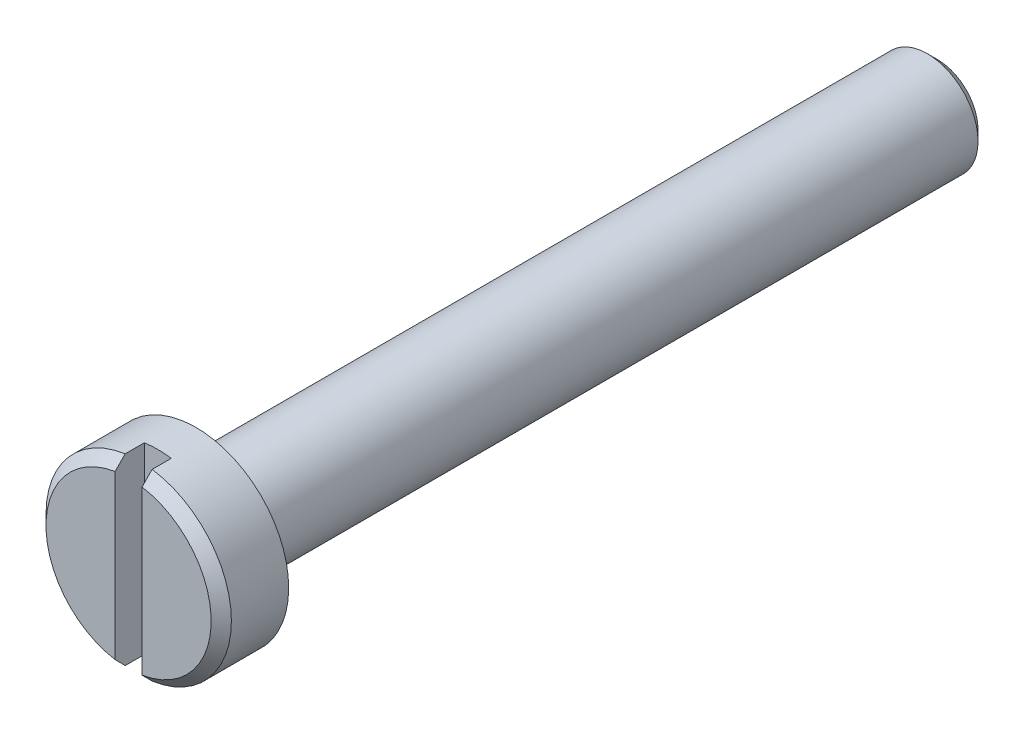
ISO-10303-21;
HEADER;
FILE_DESCRIPTION(('STEP AP214'),'2;1');
FILE_NAME('part.step','',(''),(''),'','','');
FILE_SCHEMA(('AUTOMOTIVE_DESIGN { 1 0 10303 214 1 1 1 1 }'));
ENDSEC;
DATA;
#1=APPLICATION_CONTEXT('core data for automotive mechanical design processes');
#2=APPLICATION_PROTOCOL_DEFINITION('international standard','automotive_design',2000,#1);
#3=PRODUCT_CONTEXT('',#1,'mechanical');
#4=PRODUCT('Part','Part','',(#3));
#5=PRODUCT_RELATED_PRODUCT_CATEGORY('part','',(#4));
#6=PRODUCT_DEFINITION_FORMATION('','',#4);
#7=PRODUCT_DEFINITION_CONTEXT('part definition',#1,'design');
#8=PRODUCT_DEFINITION('design','',#6,#7);
#9=PRODUCT_DEFINITION_SHAPE('','',#8);
#10=(LENGTH_UNIT() NAMED_UNIT(*) SI_UNIT(.MILLI.,.METRE.));
#11=(NAMED_UNIT(*) PLANE_ANGLE_UNIT() SI_UNIT($,.RADIAN.));
#12=(NAMED_UNIT(*) SI_UNIT($,.STERADIAN.) SOLID_ANGLE_UNIT());
#13=UNCERTAINTY_MEASURE_WITH_UNIT(LENGTH_MEASURE(1.E-05),#10,'distance_accuracy_value','');
#14=(GEOMETRIC_REPRESENTATION_CONTEXT(3) GLOBAL_UNCERTAINTY_ASSIGNED_CONTEXT((#13)) GLOBAL_UNIT_ASSIGNED_CONTEXT((#10,
#11,#12)) REPRESENTATION_CONTEXT('',''));
#15=CARTESIAN_POINT('',(0.,0.,0.));
#16=DIRECTION('',(0.,0.,1.));
#17=DIRECTION('',(1.,0.,0.));
#18=AXIS2_PLACEMENT_3D('',#15,#16,#17);
#19=CARTESIAN_POINT('',(0.,0.,2.));
#20=DIRECTION('',(0.,0.,1.));
#21=DIRECTION('',(1.,0.,0.));
#22=AXIS2_PLACEMENT_3D('',#19,#20,#21);
#23=PLANE('',#22);
#24=DIRECTION('',(0.,-1.,0.));
#25=VECTOR('',#24,1.);
#26=CARTESIAN_POINT('',(-0.4,0.,2.));
#27=LINE('',#26,#25);
#28=CARTESIAN_POINT('',(-0.4,2.41712639305437,2.));
#29=VERTEX_POINT('',#28);
#30=CARTESIAN_POINT('',(-0.4,-2.41712639305437,2.));
#31=VERTEX_POINT('',#30);
#32=EDGE_CURVE('E110',#29,#31,#27,.T.);
#33=ORIENTED_EDGE('',*,*,#32,.F.);
#34=CARTESIAN_POINT('',(0.,0.,2.));
#35=DIRECTION('',(0.,0.,1.));
#36=DIRECTION('',(1.,0.,0.));
#37=AXIS2_PLACEMENT_3D('',#34,#35,#36);
#38=CIRCLE('',#37,2.45);
#39=EDGE_CURVE('E134',#29,#31,#38,.T.);
#40=ORIENTED_EDGE('',*,*,#39,.T.);
#41=EDGE_LOOP('',(#33,#40));
#42=FACE_BOUND('',#41,.T.);
#43=ADVANCED_FACE('F35',(#42),#23,.T.);
#44=CARTESIAN_POINT('',(0.,0.,2.));
#45=DIRECTION('',(0.,0.,-1.));
#46=DIRECTION('',(-1.,0.,0.));
#47=AXIS2_PLACEMENT_3D('',#44,#45,#46);
#48=CONICAL_SURFACE('',#47,2.45,0.785398163397444);
#49=CARTESIAN_POINT('',(-0.4,6.04187900816895,-1.6051054449409));
#50=CARTESIAN_POINT('',(-0.4,5.83371761134151,-1.39740247856647));
#51=CARTESIAN_POINT('',(-0.4,5.62553628480855,-1.18971946726711));
#52=CARTESIAN_POINT('',(-0.4,5.20910350876451,-0.774415079748419));
#53=CARTESIAN_POINT('',(-0.4,5.00085205788207,-0.56679370490423));
#54=CARTESIAN_POINT('',(-0.4,4.58415907704698,-0.151544948861728));
#55=CARTESIAN_POINT('',(-0.4,4.37571750377377,0.0560823888685346));
#56=CARTESIAN_POINT('',(-0.4,3.95869973668701,0.471193398674151));
#57=CARTESIAN_POINT('',(-0.4,3.7501235456949,0.678677073582959));
#58=CARTESIAN_POINT('',(-0.4,3.33069138455204,1.0954587648502));
#59=CARTESIAN_POINT('',(-0.4,3.11983318358335,1.30475453627535));
#60=CARTESIAN_POINT('',(-0.4,2.69770631030097,1.72295751502337));
#61=CARTESIAN_POINT('',(-0.4,2.48643761424796,1.93186469841837));
#62=CARTESIAN_POINT('',(-0.4,2.16893930210294,2.2445586007645));
#63=CARTESIAN_POINT('',(-0.4,2.06302312692581,2.34866331265257));
#64=CARTESIAN_POINT('',(-0.4,1.85085482225619,2.55653499003892));
#65=CARTESIAN_POINT('',(-0.4,1.74460268475394,2.66030194736318));
#66=CARTESIAN_POINT('',(-0.4,1.53156707578726,2.86726743009412));
#67=CARTESIAN_POINT('',(-0.4,1.42478366438057,2.97046601709267));
#68=CARTESIAN_POINT('',(-0.4,1.26384149335064,3.12445874517988));
#69=CARTESIAN_POINT('',(-0.4,1.21006731503438,3.17565447362706));
#70=CARTESIAN_POINT('',(-0.4,1.10214437340177,3.2776492043593));
#71=CARTESIAN_POINT('',(-0.4,1.0479956153971,3.32844821224836));
#72=CARTESIAN_POINT('',(-0.4,0.964010735540221,3.40635423578765));
#73=CARTESIAN_POINT('',(-0.4,0.934374982270672,3.43367706635221));
#74=CARTESIAN_POINT('',(-0.4,0.874885297516148,3.48808564797149));
#75=CARTESIAN_POINT('',(-0.4,0.845031361188344,3.51517139373433));
#76=CARTESIAN_POINT('',(-0.4,0.785040524763084,3.56902730837042));
#77=CARTESIAN_POINT('',(-0.4,0.754903633292138,3.59579748680868));
#78=CARTESIAN_POINT('',(-0.4,0.694247271266364,3.64889639544467));
#79=CARTESIAN_POINT('',(-0.4,0.663727818243613,3.6752251457439));
#80=CARTESIAN_POINT('',(-0.4,0.586591375184737,3.74045098232362));
#81=CARTESIAN_POINT('',(-0.4,0.539643805134429,3.77896587711858));
#82=CARTESIAN_POINT('',(-0.4,0.467669192218732,3.83478412238803));
#83=CARTESIAN_POINT('',(-0.4,0.443409126824382,3.85307119330015));
#84=CARTESIAN_POINT('',(-0.4,0.394186586002643,3.88866865550255));
#85=CARTESIAN_POINT('',(-0.4,0.369224317075963,3.90597932951872));
#86=CARTESIAN_POINT('',(-0.4,0.313612086685805,3.94223590583444));
#87=CARTESIAN_POINT('',(-0.4,0.282767282170441,3.96088778436172));
#88=CARTESIAN_POINT('',(-0.4,0.219169630242062,3.99468611329903));
#89=CARTESIAN_POINT('',(-0.4,0.186420173057594,4.00983856715098));
#90=CARTESIAN_POINT('',(-0.4,0.129138688869982,4.03023322241158));
#91=CARTESIAN_POINT('',(-0.4,0.105204877784478,4.03709138255115));
#92=CARTESIAN_POINT('',(-0.4,0.056564214130713,4.04671672813726));
#93=CARTESIAN_POINT('',(-0.4,0.0318603661257518,4.04949817260382));
#94=CARTESIAN_POINT('',(-0.4,-0.0177585220230611,4.05037755095695));
#95=CARTESIAN_POINT('',(-0.4,-0.0426740027748057,4.04845230654372));
#96=CARTESIAN_POINT('',(-0.4,-0.0918173310269197,4.0403215307919));
#97=CARTESIAN_POINT('',(-0.4,-0.116043150706102,4.03410451086268));
#98=CARTESIAN_POINT('',(-0.4,-0.164302837173594,4.01819687939001));
#99=CARTESIAN_POINT('',(-0.4,-0.188294057076777,4.00838270309727));
#100=CARTESIAN_POINT('',(-0.4,-0.235209065806343,3.98643505531762));
#101=CARTESIAN_POINT('',(-0.4,-0.258130817009079,3.97429736471772));
#102=CARTESIAN_POINT('',(-0.4,-0.303259708530739,3.94838011910797));
#103=CARTESIAN_POINT('',(-0.4,-0.325459470587693,3.93458794713978));
#104=CARTESIAN_POINT('',(-0.4,-0.36913299786486,3.90595054324437));
#105=CARTESIAN_POINT('',(-0.4,-0.39060736917368,3.89110622425397));
#106=CARTESIAN_POINT('',(-0.4,-0.457913858615408,3.84284418080123));
#107=CARTESIAN_POINT('',(-0.4,-0.502764562619781,3.80806822868964));
#108=CARTESIAN_POINT('',(-0.4,-0.591064708773684,3.7367703425219));
#109=CARTESIAN_POINT('',(-0.4,-0.634513213782449,3.70024727968326));
#110=CARTESIAN_POINT('',(-0.4,-0.720606835455286,3.62611033861204));
#111=CARTESIAN_POINT('',(-0.4,-0.763250336426233,3.58849458651154));
#112=CARTESIAN_POINT('',(-0.4,-0.847944798158272,3.51263083240036));
#113=CARTESIAN_POINT('',(-0.4,-0.889995928352666,3.47438301826869));
#114=CARTESIAN_POINT('',(-0.4,-1.01531389383742,3.3592388309858));
#115=CARTESIAN_POINT('',(-0.4,-1.09800275769576,3.28171455348275));
#116=CARTESIAN_POINT('',(-0.4,-1.26249153577637,3.12591042267973));
#117=CARTESIAN_POINT('',(-0.4,-1.34429230662353,3.04763146675777));
#118=CARTESIAN_POINT('',(-0.4,-1.50703075959246,2.89094265583905));
#119=CARTESIAN_POINT('',(-0.4,-1.58797069024878,2.81253513610644));
#120=CARTESIAN_POINT('',(-0.4,-1.74954638599771,2.65540713794736));
#121=CARTESIAN_POINT('',(-0.4,-1.83018214965262,2.57668665804522));
#122=CARTESIAN_POINT('',(-0.4,-2.07178945948886,2.34021253319599));
#123=CARTESIAN_POINT('',(-0.4,-2.23245784751775,2.18214928089965));
#124=CARTESIAN_POINT('',(-0.4,-2.55345283015727,1.865537761934));
#125=CARTESIAN_POINT('',(-0.4,-2.71377924612668,1.70698931451169));
#126=CARTESIAN_POINT('',(-0.4,-3.0341828116126,1.38964374748769));
#127=CARTESIAN_POINT('',(-0.4,-3.19425996344273,1.23084663022189));
#128=CARTESIAN_POINT('',(-0.4,-3.67424143851139,0.754247024838357));
#129=CARTESIAN_POINT('',(-0.4,-3.99391752213833,0.436214778046816));
#130=CARTESIAN_POINT('',(-0.4,-4.63295297265011,-0.200099271816747));
#131=CARTESIAN_POINT('',(-0.4,-4.95231236974096,-0.518381044574144));
#132=CARTESIAN_POINT('',(-0.4,-5.39999718674816,-0.96478319076714));
#133=CARTESIAN_POINT('',(-0.4,-5.52839076585853,-1.09283521041089));
#134=CARTESIAN_POINT('',(-0.4,-5.78515211173623,-1.34895708361286));
#135=CARTESIAN_POINT('',(-0.4,-5.91351987918614,-1.47702693648678));
#136=CARTESIAN_POINT('',(-0.4,-6.04187900816895,-1.6051054449409));
#137=B_SPLINE_CURVE_WITH_KNOTS('',3,(#49,#50,#51,#52,#53,#54,#55,#56,#57,#58,#59,#60,#61,#62,
#63,#64,#65,#66,#67,#68,#69,#70,#71,#72,#73,#74,#75,#76,#77,#78,#79,#80,#81,#82,#83,#84,#85,#86,
#87,#88,#89,#90,#91,#92,#93,#94,#95,#96,#97,#98,#99,#100,#101,#102,#103,#104,#105,#106,#107,
#108,#109,#110,#111,#112,#113,#114,#115,#116,#117,#118,#119,#120,#121,#122,#123,#124,#125,#126,
#127,#128,#129,#130,#131,#132,#133,#134,#135,#136),.UNSPECIFIED.,.F.,.F.,(4,2,2,2,2,2,2,2,2,2,2,
2,2,2,2,2,2,2,2,2,2,2,2,2,2,2,2,2,2,2,2,2,2,2,2,2,2,2,2,2,2,2,2,4),(0.,0.882182089326138,
1.76438256919671,2.64699967204616,3.52959884078871,4.42088602139291,5.31222637874962,
5.75776396592012,6.2033122565768,6.64881127562902,6.87155211264218,7.0942897975425,
7.2152157590414,7.33614441283595,7.45706939174954,7.57798884901337,7.76009923429502,
7.85122470701068,7.94232365648787,8.0503536573466,8.15819692722298,8.23262309568974,
8.30678831931819,8.381319507947,8.45605098561627,8.53363585186421,8.61136295901566,
8.68972580225039,8.76802146416194,8.9381755091179,9.10844101338491,9.27901810135839,
9.44954536654293,9.78957010149452,10.1292309530245,10.467298985287,10.8053686134916,
11.481521139851,12.1579671726471,12.8344068889023,14.1871945818616,15.5398376502779,
16.0838413954936,16.6278280999355),.UNSPECIFIED.);
#138=CARTESIAN_POINT('',(-0.4,2.72075357208256,1.7));
#139=VERTEX_POINT('',#138);
#140=EDGE_CURVE('E191',#139,#29,#137,.T.);
#141=ORIENTED_EDGE('',*,*,#140,.F.);
#142=CARTESIAN_POINT('',(0.,0.,1.7));
#143=DIRECTION('',(0.,0.,1.));
#144=DIRECTION('',(1.,0.,0.));
#145=AXIS2_PLACEMENT_3D('',#142,#143,#144);
#146=CIRCLE('',#145,2.75);
#147=CARTESIAN_POINT('',(-0.4,-2.72075357208256,1.7));
#148=VERTEX_POINT('',#147);
#149=EDGE_CURVE('E136',#148,#139,#146,.F.);
#150=ORIENTED_EDGE('',*,*,#149,.F.);
#151=EDGE_CURVE('E143',#31,#148,#137,.T.);
#152=ORIENTED_EDGE('',*,*,#151,.F.);
#153=ORIENTED_EDGE('',*,*,#39,.F.);
#154=EDGE_LOOP('',(#141,#150,#152,#153));
#155=FACE_BOUND('',#154,.T.);
#156=ADVANCED_FACE('F170',(#155),#48,.T.);
#157=CARTESIAN_POINT('',(0.,0.,-22.));
#158=DIRECTION('',(0.,0.,1.));
#159=DIRECTION('',(1.,0.,0.));
#160=AXIS2_PLACEMENT_3D('',#157,#158,#159);
#161=CYLINDRICAL_SURFACE('',#160,1.5);
#162=CARTESIAN_POINT('',(0.,0.,-21.7));
#163=DIRECTION('',(0.,0.,1.));
#164=DIRECTION('',(1.,0.,0.));
#165=AXIS2_PLACEMENT_3D('',#162,#163,#164);
#166=CIRCLE('',#165,1.5);
#167=CARTESIAN_POINT('',(1.5,0.,-21.7));
#168=VERTEX_POINT('',#167);
#169=EDGE_CURVE('E125',#168,#168,#166,.T.);
#170=ORIENTED_EDGE('',*,*,#169,.T.);
#171=EDGE_LOOP('',(#170));
#172=FACE_BOUND('',#171,.T.);
#173=CARTESIAN_POINT('',(0.,0.,0.));
#174=DIRECTION('',(0.,0.,1.));
#175=DIRECTION('',(1.,0.,0.));
#176=AXIS2_PLACEMENT_3D('',#173,#174,#175);
#177=CIRCLE('',#176,1.5);
#178=CARTESIAN_POINT('',(1.5,0.,0.));
#179=VERTEX_POINT('',#178);
#180=EDGE_CURVE('E122',#179,#179,#177,.T.);
#181=ORIENTED_EDGE('',*,*,#180,.F.);
#182=EDGE_LOOP('',(#181));
#183=FACE_BOUND('',#182,.T.);
#184=ADVANCED_FACE('F167',(#172,#183),#161,.T.);
#185=CARTESIAN_POINT('',(0.,0.,-22.));
#186=DIRECTION('',(0.,0.,1.));
#187=DIRECTION('',(1.,0.,0.));
#188=AXIS2_PLACEMENT_3D('',#185,#186,#187);
#189=PLANE('',#188);
#190=CARTESIAN_POINT('',(0.,0.,-22.));
#191=DIRECTION('',(0.,0.,1.));
#192=DIRECTION('',(1.,0.,0.));
#193=AXIS2_PLACEMENT_3D('',#190,#191,#192);
#194=CIRCLE('',#193,1.2);
#195=CARTESIAN_POINT('',(1.2,0.,-22.));
#196=VERTEX_POINT('',#195);
#197=EDGE_CURVE('E128',#196,#196,#194,.F.);
#198=ORIENTED_EDGE('',*,*,#197,.T.);
#199=EDGE_LOOP('',(#198));
#200=FACE_BOUND('',#199,.T.);
#201=ADVANCED_FACE('F164',(#200),#189,.F.);
#202=CARTESIAN_POINT('',(0.,0.,2.));
#203=DIRECTION('',(0.,0.,-1.));
#204=DIRECTION('',(-1.,0.,0.));
#205=AXIS2_PLACEMENT_3D('',#202,#203,#204);
#206=CYLINDRICAL_SURFACE('',#205,2.75);
#207=ORIENTED_EDGE('',*,*,#149,.T.);
#208=DIRECTION('',(0.,0.,-1.));
#209=VECTOR('',#208,1.);
#210=CARTESIAN_POINT('',(-0.4,2.72075357208256,2.));
#211=LINE('',#210,#209);
#212=CARTESIAN_POINT('',(-0.4,2.72075357208256,1.13273808557404));
#213=VERTEX_POINT('',#212);
#214=EDGE_CURVE('E59',#139,#213,#211,.T.);
#215=ORIENTED_EDGE('',*,*,#214,.T.);
#216=CARTESIAN_POINT('',(0.,0.,1.13273808557404));
#217=DIRECTION('',(0.,0.,-1.));
#218=DIRECTION('',(-1.,0.,0.));
#219=AXIS2_PLACEMENT_3D('',#216,#217,#218);
#220=CIRCLE('',#219,2.75);
#221=CARTESIAN_POINT('',(0.4,2.72075357208256,1.13273808557404));
#222=VERTEX_POINT('',#221);
#223=EDGE_CURVE('E40',#213,#222,#220,.T.);
#224=ORIENTED_EDGE('',*,*,#223,.T.);
#225=DIRECTION('',(0.,0.,-1.));
#226=VECTOR('',#225,1.);
#227=CARTESIAN_POINT('',(0.4,2.72075357208256,2.));
#228=LINE('',#227,#226);
#229=CARTESIAN_POINT('',(0.4,2.72075357208256,1.7));
#230=VERTEX_POINT('',#229);
#231=EDGE_CURVE('E102',#222,#230,#228,.F.);
#232=ORIENTED_EDGE('',*,*,#231,.T.);
#233=CARTESIAN_POINT('',(0.4,-2.72075357208256,1.7));
#234=VERTEX_POINT('',#233);
#235=EDGE_CURVE('E109',#230,#234,#146,.F.);
#236=ORIENTED_EDGE('',*,*,#235,.T.);
#237=DIRECTION('',(0.,0.,-1.));
#238=VECTOR('',#237,1.);
#239=CARTESIAN_POINT('',(0.4,-2.72075357208256,2.));
#240=LINE('',#239,#238);
#241=CARTESIAN_POINT('',(0.4,-2.72075357208256,1.13273808557404));
#242=VERTEX_POINT('',#241);
#243=EDGE_CURVE('E99',#234,#242,#240,.T.);
#244=ORIENTED_EDGE('',*,*,#243,.T.);
#245=CARTESIAN_POINT('',(-0.4,-2.72075357208256,1.13273808557404));
#246=VERTEX_POINT('',#245);
#247=EDGE_CURVE('E11',#242,#246,#220,.T.);
#248=ORIENTED_EDGE('',*,*,#247,.T.);
#249=DIRECTION('',(0.,0.,-1.));
#250=VECTOR('',#249,1.);
#251=CARTESIAN_POINT('',(-0.4,-2.72075357208256,2.));
#252=LINE('',#251,#250);
#253=EDGE_CURVE('E112',#246,#148,#252,.F.);
#254=ORIENTED_EDGE('',*,*,#253,.T.);
#255=EDGE_LOOP('',(#207,#215,#224,#232,#236,#244,#248,#254));
#256=FACE_BOUND('',#255,.T.);
#257=CARTESIAN_POINT('',(0.,0.,0.));
#258=DIRECTION('',(0.,0.,1.));
#259=DIRECTION('',(1.,0.,0.));
#260=AXIS2_PLACEMENT_3D('',#257,#258,#259);
#261=CIRCLE('',#260,2.75);
#262=CARTESIAN_POINT('',(2.75,0.,0.));
#263=VERTEX_POINT('',#262);
#264=EDGE_CURVE('E119',#263,#263,#261,.T.);
#265=ORIENTED_EDGE('',*,*,#264,.T.);
#266=EDGE_LOOP('',(#265));
#267=FACE_BOUND('',#266,.T.);
#268=ADVANCED_FACE('F106',(#256,#267),#206,.T.);
#269=DIRECTION('',(0.,1.,0.));
#270=VECTOR('',#269,1.);
#271=CARTESIAN_POINT('',(0.4,0.,2.));
#272=LINE('',#271,#270);
#273=CARTESIAN_POINT('',(0.4,-2.41712639305437,2.));
#274=VERTEX_POINT('',#273);
#275=CARTESIAN_POINT('',(0.4,2.41712639305437,2.));
#276=VERTEX_POINT('',#275);
#277=EDGE_CURVE('E51',#274,#276,#272,.T.);
#278=ORIENTED_EDGE('',*,*,#277,.F.);
#279=EDGE_CURVE('E131',#274,#276,#38,.T.);
#280=ORIENTED_EDGE('',*,*,#279,.T.);
#281=EDGE_LOOP('',(#278,#280));
#282=FACE_BOUND('',#281,.T.);
#283=ADVANCED_FACE('F153',(#282),#23,.T.);
#284=CARTESIAN_POINT('',(0.,0.,0.));
#285=DIRECTION('',(0.,0.,1.));
#286=DIRECTION('',(1.,0.,0.));
#287=AXIS2_PLACEMENT_3D('',#284,#285,#286);
#288=PLANE('',#287);
#289=ORIENTED_EDGE('',*,*,#180,.T.);
#290=EDGE_LOOP('',(#289));
#291=FACE_BOUND('',#290,.T.);
#292=ORIENTED_EDGE('',*,*,#264,.F.);
#293=EDGE_LOOP('',(#292));
#294=FACE_BOUND('',#293,.T.);
#295=ADVANCED_FACE('F156',(#291,#294),#288,.F.);
#296=CARTESIAN_POINT('',(0.,0.,-21.7));
#297=DIRECTION('',(0.,0.,1.));
#298=DIRECTION('',(1.,0.,0.));
#299=AXIS2_PLACEMENT_3D('',#296,#297,#298);
#300=CONICAL_SURFACE('',#299,1.5,0.785398163397443);
#301=ORIENTED_EDGE('',*,*,#197,.F.);
#302=EDGE_LOOP('',(#301));
#303=FACE_BOUND('',#302,.T.);
#304=ORIENTED_EDGE('',*,*,#169,.F.);
#305=EDGE_LOOP('',(#304));
#306=FACE_BOUND('',#305,.T.);
#307=ADVANCED_FACE('F160',(#303,#306),#300,.T.);
#308=CARTESIAN_POINT('',(0.4,-6.04187900816895,-1.6051054449409));
#309=CARTESIAN_POINT('',(0.4,-5.83371761134151,-1.39740247856647));
#310=CARTESIAN_POINT('',(0.4,-5.62553628480855,-1.18971946726711));
#311=CARTESIAN_POINT('',(0.4,-5.20910350876451,-0.774415079748422));
#312=CARTESIAN_POINT('',(0.4,-5.00085205788207,-0.566793704904233));
#313=CARTESIAN_POINT('',(0.4,-4.58415907704698,-0.151544948861732));
#314=CARTESIAN_POINT('',(0.4,-4.37571750377377,0.0560823888685296));
#315=CARTESIAN_POINT('',(0.4,-3.95869973668701,0.471193398674145));
#316=CARTESIAN_POINT('',(0.4,-3.75012354569491,0.678677073582951));
#317=CARTESIAN_POINT('',(0.4,-3.33069138455205,1.09545876485019));
#318=CARTESIAN_POINT('',(0.4,-3.11983318358336,1.30475453627534));
#319=CARTESIAN_POINT('',(0.4,-2.69770631030097,1.72295751502337));
#320=CARTESIAN_POINT('',(0.4,-2.48643761424797,1.93186469841837));
#321=CARTESIAN_POINT('',(0.4,-2.16893930210294,2.2445586007645));
#322=CARTESIAN_POINT('',(0.4,-2.06302312692581,2.34866331265257));
#323=CARTESIAN_POINT('',(0.4,-1.85085482225619,2.55653499003892));
#324=CARTESIAN_POINT('',(0.4,-1.74460268475394,2.66030194736318));
#325=CARTESIAN_POINT('',(0.4,-1.53156707578726,2.86726743009412));
#326=CARTESIAN_POINT('',(0.4,-1.42478366438057,2.97046601709267));
#327=CARTESIAN_POINT('',(0.4,-1.26384149335064,3.12445874517988));
#328=CARTESIAN_POINT('',(0.4,-1.21006731503438,3.17565447362707));
#329=CARTESIAN_POINT('',(0.4,-1.10214437340177,3.2776492043593));
#330=CARTESIAN_POINT('',(0.4,-1.0479956153971,3.32844821224836));
#331=CARTESIAN_POINT('',(0.4,-0.964010735540221,3.40635423578765));
#332=CARTESIAN_POINT('',(0.4,-0.934374982270671,3.43367706635221));
#333=CARTESIAN_POINT('',(0.4,-0.874885297516147,3.48808564797149));
#334=CARTESIAN_POINT('',(0.4,-0.845031361188343,3.51517139373433));
#335=CARTESIAN_POINT('',(0.4,-0.785040524763084,3.56902730837042));
#336=CARTESIAN_POINT('',(0.4,-0.754903633292138,3.59579748680868));
#337=CARTESIAN_POINT('',(0.4,-0.694247271266364,3.64889639544467));
#338=CARTESIAN_POINT('',(0.4,-0.663727818243613,3.6752251457439));
#339=CARTESIAN_POINT('',(0.4,-0.586591375184737,3.74045098232362));
#340=CARTESIAN_POINT('',(0.4,-0.539643805134429,3.77896587711858));
#341=CARTESIAN_POINT('',(0.4,-0.467669192218733,3.83478412238803));
#342=CARTESIAN_POINT('',(0.4,-0.443409126824383,3.85307119330015));
#343=CARTESIAN_POINT('',(0.4,-0.394186586002643,3.88866865550255));
#344=CARTESIAN_POINT('',(0.4,-0.369224317075963,3.90597932951872));
#345=CARTESIAN_POINT('',(0.4,-0.313612086685805,3.94223590583444));
#346=CARTESIAN_POINT('',(0.4,-0.28276728217044,3.96088778436172));
#347=CARTESIAN_POINT('',(0.4,-0.219169630242062,3.99468611329903));
#348=CARTESIAN_POINT('',(0.4,-0.186420173057593,4.00983856715098));
#349=CARTESIAN_POINT('',(0.4,-0.129138688869981,4.03023322241158));
#350=CARTESIAN_POINT('',(0.4,-0.105204877784476,4.03709138255115));
#351=CARTESIAN_POINT('',(0.4,-0.0565642141307115,4.04671672813726));
#352=CARTESIAN_POINT('',(0.4,-0.0318603661257507,4.04949817260382));
#353=CARTESIAN_POINT('',(0.4,0.0177585220230611,4.05037755095695));
#354=CARTESIAN_POINT('',(0.4,0.0426740027748052,4.04845230654372));
#355=CARTESIAN_POINT('',(0.4,0.0918173310269193,4.0403215307919));
#356=CARTESIAN_POINT('',(0.4,0.116043150706102,4.03410451086268));
#357=CARTESIAN_POINT('',(0.4,0.164302837173595,4.01819687939001));
#358=CARTESIAN_POINT('',(0.4,0.188294057076778,4.00838270309727));
#359=CARTESIAN_POINT('',(0.4,0.235209065806344,3.98643505531761));
#360=CARTESIAN_POINT('',(0.4,0.258130817009081,3.97429736471771));
#361=CARTESIAN_POINT('',(0.4,0.303259708530742,3.94838011910797));
#362=CARTESIAN_POINT('',(0.4,0.325459470587696,3.93458794713978));
#363=CARTESIAN_POINT('',(0.4,0.369132997864863,3.90595054324437));
#364=CARTESIAN_POINT('',(0.4,0.390607369173683,3.89110622425397));
#365=CARTESIAN_POINT('',(0.4,0.45791385861541,3.84284418080123));
#366=CARTESIAN_POINT('',(0.4,0.502764562619783,3.80806822868964));
#367=CARTESIAN_POINT('',(0.4,0.591064708773687,3.73677034252189));
#368=CARTESIAN_POINT('',(0.4,0.634513213782453,3.70024727968326));
#369=CARTESIAN_POINT('',(0.4,0.72060683545529,3.62611033861204));
#370=CARTESIAN_POINT('',(0.4,0.763250336426238,3.58849458651153));
#371=CARTESIAN_POINT('',(0.4,0.847944798158277,3.51263083240036));
#372=CARTESIAN_POINT('',(0.4,0.889995928352672,3.47438301826869));
#373=CARTESIAN_POINT('',(0.4,1.01531389383743,3.3592388309858));
#374=CARTESIAN_POINT('',(0.4,1.09800275769577,3.28171455348274));
#375=CARTESIAN_POINT('',(0.4,1.26249153577638,3.12591042267972));
#376=CARTESIAN_POINT('',(0.4,1.34429230662354,3.04763146675776));
#377=CARTESIAN_POINT('',(0.4,1.50703075959247,2.89094265583904));
#378=CARTESIAN_POINT('',(0.4,1.58797069024878,2.81253513610644));
#379=CARTESIAN_POINT('',(0.4,1.74954638599771,2.65540713794735));
#380=CARTESIAN_POINT('',(0.4,1.83018214965263,2.57668665804521));
#381=CARTESIAN_POINT('',(0.4,2.07178945948887,2.34021253319598));
#382=CARTESIAN_POINT('',(0.4,2.23245784751776,2.18214928089964));
#383=CARTESIAN_POINT('',(0.4,2.55345283015728,1.86553776193399));
#384=CARTESIAN_POINT('',(0.4,2.7137792461267,1.70698931451167));
#385=CARTESIAN_POINT('',(0.4,3.03418281161261,1.38964374748767));
#386=CARTESIAN_POINT('',(0.4,3.19425996344275,1.23084663022187));
#387=CARTESIAN_POINT('',(0.4,3.67424143851141,0.754247024838335));
#388=CARTESIAN_POINT('',(0.4,3.99391752213835,0.436214778046792));
#389=CARTESIAN_POINT('',(0.4,4.63295297265014,-0.200099271816774));
#390=CARTESIAN_POINT('',(0.4,4.95231236974099,-0.518381044574174));
#391=CARTESIAN_POINT('',(0.4,5.39999718674818,-0.964783190767166));
#392=CARTESIAN_POINT('',(0.4,5.52839076585855,-1.09283521041091));
#393=CARTESIAN_POINT('',(0.4,5.78515211173624,-1.34895708361286));
#394=CARTESIAN_POINT('',(0.4,5.91351987918615,-1.47702693648679));
#395=CARTESIAN_POINT('',(0.4,6.04187900816895,-1.6051054449409));
#396=B_SPLINE_CURVE_WITH_KNOTS('',3,(#308,#309,#310,#311,#312,#313,#314,#315,#316,#317,#318,
#319,#320,#321,#322,#323,#324,#325,#326,#327,#328,#329,#330,#331,#332,#333,#334,#335,#336,#337,
#338,#339,#340,#341,#342,#343,#344,#345,#346,#347,#348,#349,#350,#351,#352,#353,#354,#355,#356,
#357,#358,#359,#360,#361,#362,#363,#364,#365,#366,#367,#368,#369,#370,#371,#372,#373,#374,#375,
#376,#377,#378,#379,#380,#381,#382,#383,#384,#385,#386,#387,#388,#389,#390,#391,#392,#393,#394,
#395),.UNSPECIFIED.,.F.,.F.,(4,2,2,2,2,2,2,2,2,2,2,2,2,2,2,2,2,2,2,2,2,2,2,2,2,2,2,2,2,2,2,2,2,
2,2,2,2,2,2,2,2,2,2,4),(0.,0.882182089326135,1.76438256919671,2.64699967204615,3.5295988407887,
4.4208860213929,5.31222637874961,5.75776396592012,6.2033122565768,6.64881127562902,
6.87155211264218,7.0942897975425,7.2152157590414,7.33614441283595,7.45706939174954,
7.57798884901337,7.76009923429501,7.85122470701068,7.94232365648787,8.0503536573466,
8.15819692722298,8.23262309568974,8.30678831931819,8.381319507947,8.45605098561627,
8.53363585186421,8.61136295901566,8.6897258022504,8.76802146416194,8.9381755091179,
9.10844101338492,9.2790181013584,9.44954536654293,9.78957010149453,10.1292309530245,
10.467298985287,10.8053686134916,11.4815211398511,12.1579671726471,12.8344068889023,
14.1871945818617,15.539837650278,16.0838413954936,16.6278280999355),.UNSPECIFIED.);
#397=EDGE_CURVE('E142',#234,#274,#396,.T.);
#398=ORIENTED_EDGE('',*,*,#397,.F.);
#399=ORIENTED_EDGE('',*,*,#235,.F.);
#400=EDGE_CURVE('E137',#276,#230,#396,.T.);
#401=ORIENTED_EDGE('',*,*,#400,.F.);
#402=ORIENTED_EDGE('',*,*,#279,.F.);
#403=EDGE_LOOP('',(#398,#399,#401,#402));
#404=FACE_BOUND('',#403,.T.);
#405=ADVANCED_FACE('F37',(#404),#48,.T.);
#406=CARTESIAN_POINT('',(0.4,-2.75,1.13273808557404));
#407=DIRECTION('',(0.,0.,-1.));
#408=DIRECTION('',(-1.,0.,0.));
#409=AXIS2_PLACEMENT_3D('',#406,#407,#408);
#410=PLANE('',#409);
#411=DIRECTION('',(0.,1.,0.));
#412=VECTOR('',#411,1.);
#413=CARTESIAN_POINT('',(-0.4,-2.75,1.13273808557404));
#414=LINE('',#413,#412);
#415=EDGE_CURVE('E94',#246,#213,#414,.T.);
#416=ORIENTED_EDGE('',*,*,#415,.F.);
#417=ORIENTED_EDGE('',*,*,#247,.F.);
#418=DIRECTION('',(0.,1.,0.));
#419=VECTOR('',#418,1.);
#420=CARTESIAN_POINT('',(0.4,-2.75,1.13273808557404));
#421=LINE('',#420,#419);
#422=EDGE_CURVE('E92',#242,#222,#421,.T.);
#423=ORIENTED_EDGE('',*,*,#422,.T.);
#424=ORIENTED_EDGE('',*,*,#223,.F.);
#425=EDGE_LOOP('',(#416,#417,#423,#424));
#426=FACE_BOUND('',#425,.T.);
#427=ADVANCED_FACE('F91',(#426),#410,.F.);
#428=CARTESIAN_POINT('',(-0.4,-2.75,2.83273808557404));
#429=DIRECTION('',(-1.,0.,0.));
#430=DIRECTION('',(0.,0.,1.));
#431=AXIS2_PLACEMENT_3D('',#428,#429,#430);
#432=PLANE('',#431);
#433=ORIENTED_EDGE('',*,*,#140,.T.);
#434=ORIENTED_EDGE('',*,*,#32,.T.);
#435=ORIENTED_EDGE('',*,*,#151,.T.);
#436=ORIENTED_EDGE('',*,*,#253,.F.);
#437=ORIENTED_EDGE('',*,*,#415,.T.);
#438=ORIENTED_EDGE('',*,*,#214,.F.);
#439=EDGE_LOOP('',(#433,#434,#435,#436,#437,#438));
#440=FACE_BOUND('',#439,.T.);
#441=ADVANCED_FACE('F152',(#440),#432,.F.);
#442=CARTESIAN_POINT('',(0.4,-2.75,2.83273808557404));
#443=DIRECTION('',(1.,0.,0.));
#444=DIRECTION('',(0.,0.,-1.));
#445=AXIS2_PLACEMENT_3D('',#442,#443,#444);
#446=PLANE('',#445);
#447=ORIENTED_EDGE('',*,*,#397,.T.);
#448=ORIENTED_EDGE('',*,*,#277,.T.);
#449=ORIENTED_EDGE('',*,*,#400,.T.);
#450=ORIENTED_EDGE('',*,*,#231,.F.);
#451=ORIENTED_EDGE('',*,*,#422,.F.);
#452=ORIENTED_EDGE('',*,*,#243,.F.);
#453=EDGE_LOOP('',(#447,#448,#449,#450,#451,#452));
#454=FACE_BOUND('',#453,.T.);
#455=ADVANCED_FACE('F98',(#454),#446,.F.);
#456=CLOSED_SHELL('',(#43,#156,#184,#201,#268,#283,#295,#307,#405,#427,#441,#455));
#457=MANIFOLD_SOLID_BREP('B2',#456);
#458=ADVANCED_BREP_SHAPE_REPRESENTATION('',(#18,#457),#14);
#459=SHAPE_DEFINITION_REPRESENTATION(#9,#458);
ENDSEC;
END-ISO-10303-21;
